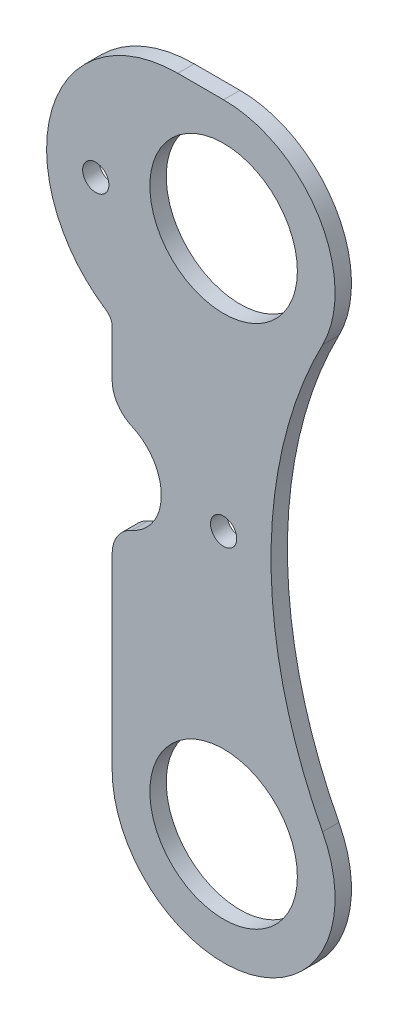
ISO-10303-21;
HEADER;
FILE_DESCRIPTION(('STEP AP214'),'2;1');
FILE_NAME('part.step','',(''),(''),'','','');
FILE_SCHEMA(('AUTOMOTIVE_DESIGN { 1 0 10303 214 1 1 1 1 }'));
ENDSEC;
DATA;
#1=APPLICATION_CONTEXT('core data for automotive mechanical design processes');
#2=APPLICATION_PROTOCOL_DEFINITION('international standard','automotive_design',2000,#1);
#3=PRODUCT_CONTEXT('',#1,'mechanical');
#4=PRODUCT('Part','Part','',(#3));
#5=PRODUCT_RELATED_PRODUCT_CATEGORY('part','',(#4));
#6=PRODUCT_DEFINITION_FORMATION('','',#4);
#7=PRODUCT_DEFINITION_CONTEXT('part definition',#1,'design');
#8=PRODUCT_DEFINITION('design','',#6,#7);
#9=PRODUCT_DEFINITION_SHAPE('','',#8);
#10=(LENGTH_UNIT() NAMED_UNIT(*) SI_UNIT(.MILLI.,.METRE.));
#11=(NAMED_UNIT(*) PLANE_ANGLE_UNIT() SI_UNIT($,.RADIAN.));
#12=(NAMED_UNIT(*) SI_UNIT($,.STERADIAN.) SOLID_ANGLE_UNIT());
#13=UNCERTAINTY_MEASURE_WITH_UNIT(LENGTH_MEASURE(1.E-05),#10,'distance_accuracy_value','');
#14=(GEOMETRIC_REPRESENTATION_CONTEXT(3) GLOBAL_UNCERTAINTY_ASSIGNED_CONTEXT((#13)) GLOBAL_UNIT_ASSIGNED_CONTEXT((#10,
#11,#12)) REPRESENTATION_CONTEXT('',''));
#15=CARTESIAN_POINT('',(0.,0.,0.));
#16=DIRECTION('',(0.,0.,1.));
#17=DIRECTION('',(1.,0.,0.));
#18=AXIS2_PLACEMENT_3D('',#15,#16,#17);
#19=CARTESIAN_POINT('',(0.,0.,3.175));
#20=DIRECTION('',(0.,0.,-1.));
#21=DIRECTION('',(-1.,0.,0.));
#22=AXIS2_PLACEMENT_3D('',#19,#20,#21);
#23=CYLINDRICAL_SURFACE('',#22,21.59);
#24=CARTESIAN_POINT('',(0.,0.,0.));
#25=DIRECTION('',(0.,0.,-1.));
#26=DIRECTION('',(-1.,0.,0.));
#27=AXIS2_PLACEMENT_3D('',#24,#25,#26);
#28=CIRCLE('',#27,21.59);
#29=CARTESIAN_POINT('',(0.,21.59,0.));
#30=VERTEX_POINT('',#29);
#31=CARTESIAN_POINT('',(19.1590830035103,-9.9527703914339,0.));
#32=VERTEX_POINT('',#31);
#33=EDGE_CURVE('E211',#30,#32,#28,.T.);
#34=ORIENTED_EDGE('',*,*,#33,.F.);
#35=DIRECTION('',(0.,0.,1.));
#36=VECTOR('',#35,1.);
#37=CARTESIAN_POINT('',(0.,21.59,0.));
#38=LINE('',#37,#36);
#39=CARTESIAN_POINT('',(0.,21.59,3.175));
#40=VERTEX_POINT('',#39);
#41=EDGE_CURVE('E166',#30,#40,#38,.T.);
#42=ORIENTED_EDGE('',*,*,#41,.T.);
#43=CARTESIAN_POINT('',(0.,0.,3.175));
#44=DIRECTION('',(0.,0.,-1.));
#45=DIRECTION('',(-1.,0.,0.));
#46=AXIS2_PLACEMENT_3D('',#43,#44,#45);
#47=CIRCLE('',#46,21.59);
#48=CARTESIAN_POINT('',(19.1590830035103,-9.9527703914339,3.175));
#49=VERTEX_POINT('',#48);
#50=EDGE_CURVE('E206',#40,#49,#47,.T.);
#51=ORIENTED_EDGE('',*,*,#50,.T.);
#52=DIRECTION('',(0.,0.,-1.));
#53=VECTOR('',#52,1.);
#54=CARTESIAN_POINT('',(19.1590830035103,-9.9527703914339,3.175));
#55=LINE('',#54,#53);
#56=EDGE_CURVE('E214',#49,#32,#55,.T.);
#57=ORIENTED_EDGE('',*,*,#56,.T.);
#58=EDGE_LOOP('',(#34,#42,#51,#57));
#59=FACE_BOUND('',#58,.T.);
#60=ADVANCED_FACE('F74',(#59),#23,.T.);
#61=CARTESIAN_POINT('',(0.,-101.6,3.175));
#62=DIRECTION('',(0.,0.,-1.));
#63=DIRECTION('',(-1.,0.,0.));
#64=AXIS2_PLACEMENT_3D('',#61,#62,#63);
#65=CYLINDRICAL_SURFACE('',#64,14.2875);
#66=CARTESIAN_POINT('',(0.,-101.6,3.175));
#67=DIRECTION('',(0.,0.,1.));
#68=DIRECTION('',(1.,0.,0.));
#69=AXIS2_PLACEMENT_3D('',#66,#67,#68);
#70=CIRCLE('',#69,14.2875);
#71=CARTESIAN_POINT('',(14.2875,-101.6,3.175));
#72=VERTEX_POINT('',#71);
#73=EDGE_CURVE('E226',#72,#72,#70,.T.);
#74=ORIENTED_EDGE('',*,*,#73,.T.);
#75=EDGE_LOOP('',(#74));
#76=FACE_BOUND('',#75,.T.);
#77=CARTESIAN_POINT('',(0.,-101.6,0.));
#78=DIRECTION('',(0.,0.,1.));
#79=DIRECTION('',(1.,0.,0.));
#80=AXIS2_PLACEMENT_3D('',#77,#78,#79);
#81=CIRCLE('',#80,14.2875);
#82=CARTESIAN_POINT('',(14.2875,-101.6,0.));
#83=VERTEX_POINT('',#82);
#84=EDGE_CURVE('E223',#83,#83,#81,.T.);
#85=ORIENTED_EDGE('',*,*,#84,.F.);
#86=EDGE_LOOP('',(#85));
#87=FACE_BOUND('',#86,.T.);
#88=ADVANCED_FACE('F304',(#76,#87),#65,.F.);
#89=CARTESIAN_POINT('',(0.,0.,3.175));
#90=DIRECTION('',(0.,0.,-1.));
#91=DIRECTION('',(-1.,0.,0.));
#92=AXIS2_PLACEMENT_3D('',#89,#90,#91);
#93=CYLINDRICAL_SURFACE('',#92,14.2875);
#94=CARTESIAN_POINT('',(0.,0.,3.175));
#95=DIRECTION('',(0.,0.,1.));
#96=DIRECTION('',(1.,0.,0.));
#97=AXIS2_PLACEMENT_3D('',#94,#95,#96);
#98=CIRCLE('',#97,14.2875);
#99=CARTESIAN_POINT('',(14.2875,0.,3.175));
#100=VERTEX_POINT('',#99);
#101=EDGE_CURVE('E232',#100,#100,#98,.T.);
#102=ORIENTED_EDGE('',*,*,#101,.T.);
#103=EDGE_LOOP('',(#102));
#104=FACE_BOUND('',#103,.T.);
#105=CARTESIAN_POINT('',(0.,0.,0.));
#106=DIRECTION('',(0.,0.,1.));
#107=DIRECTION('',(1.,0.,0.));
#108=AXIS2_PLACEMENT_3D('',#105,#106,#107);
#109=CIRCLE('',#108,14.2875);
#110=CARTESIAN_POINT('',(14.2875,0.,0.));
#111=VERTEX_POINT('',#110);
#112=EDGE_CURVE('E229',#111,#111,#109,.T.);
#113=ORIENTED_EDGE('',*,*,#112,.F.);
#114=EDGE_LOOP('',(#113));
#115=FACE_BOUND('',#114,.T.);
#116=ADVANCED_FACE('F309',(#104,#115),#93,.F.);
#117=CARTESIAN_POINT('',(0.,-50.8,3.175));
#118=DIRECTION('',(0.,0.,-1.));
#119=DIRECTION('',(-1.,0.,0.));
#120=AXIS2_PLACEMENT_3D('',#117,#118,#119);
#121=CYLINDRICAL_SURFACE('',#120,2.54);
#122=CARTESIAN_POINT('',(0.,-50.8,3.175));
#123=DIRECTION('',(0.,0.,1.));
#124=DIRECTION('',(1.,0.,0.));
#125=AXIS2_PLACEMENT_3D('',#122,#123,#124);
#126=CIRCLE('',#125,2.54);
#127=CARTESIAN_POINT('',(2.54000000000001,-50.8,3.175));
#128=VERTEX_POINT('',#127);
#129=EDGE_CURVE('E220',#128,#128,#126,.T.);
#130=ORIENTED_EDGE('',*,*,#129,.T.);
#131=EDGE_LOOP('',(#130));
#132=FACE_BOUND('',#131,.T.);
#133=CARTESIAN_POINT('',(0.,-50.8,0.));
#134=DIRECTION('',(0.,0.,1.));
#135=DIRECTION('',(1.,0.,0.));
#136=AXIS2_PLACEMENT_3D('',#133,#134,#135);
#137=CIRCLE('',#136,2.54);
#138=CARTESIAN_POINT('',(2.54000000000001,-50.8,0.));
#139=VERTEX_POINT('',#138);
#140=EDGE_CURVE('E217',#139,#139,#137,.T.);
#141=ORIENTED_EDGE('',*,*,#140,.F.);
#142=EDGE_LOOP('',(#141));
#143=FACE_BOUND('',#142,.T.);
#144=ADVANCED_FACE('F317',(#132,#143),#121,.F.);
#145=CARTESIAN_POINT('',(-21.59,12.7,3.175));
#146=DIRECTION('',(1.,0.,0.));
#147=DIRECTION('',(0.,1.,0.));
#148=AXIS2_PLACEMENT_3D('',#145,#146,#147);
#149=PLANE('',#148);
#150=DIRECTION('',(0.,-1.,0.));
#151=VECTOR('',#150,1.);
#152=CARTESIAN_POINT('',(-21.59,12.7,3.175));
#153=LINE('',#152,#151);
#154=CARTESIAN_POINT('',(-21.59,-27.2276429215239,3.175));
#155=VERTEX_POINT('',#154);
#156=CARTESIAN_POINT('',(-21.59,-36.2503221685152,3.175));
#157=VERTEX_POINT('',#156);
#158=EDGE_CURVE('E238',#155,#157,#153,.T.);
#159=ORIENTED_EDGE('',*,*,#158,.F.);
#160=DIRECTION('',(0.,0.,1.));
#161=VECTOR('',#160,1.);
#162=CARTESIAN_POINT('',(-21.59,-27.2276429215239,3.175));
#163=LINE('',#162,#161);
#164=CARTESIAN_POINT('',(-21.59,-27.2276429215239,0.));
#165=VERTEX_POINT('',#164);
#166=EDGE_CURVE('E89',#155,#165,#163,.F.);
#167=ORIENTED_EDGE('',*,*,#166,.T.);
#168=DIRECTION('',(0.,-1.,0.));
#169=VECTOR('',#168,1.);
#170=CARTESIAN_POINT('',(-21.59,12.7,0.));
#171=LINE('',#170,#169);
#172=CARTESIAN_POINT('',(-21.59,-36.2503221685152,0.));
#173=VERTEX_POINT('',#172);
#174=EDGE_CURVE('E242',#165,#173,#171,.T.);
#175=ORIENTED_EDGE('',*,*,#174,.T.);
#176=DIRECTION('',(0.,0.,1.));
#177=VECTOR('',#176,1.);
#178=CARTESIAN_POINT('',(-21.59,-36.2503221685152,3.175));
#179=LINE('',#178,#177);
#180=EDGE_CURVE('E253',#173,#157,#179,.T.);
#181=ORIENTED_EDGE('',*,*,#180,.T.);
#182=EDGE_LOOP('',(#159,#167,#175,#181));
#183=FACE_BOUND('',#182,.T.);
#184=ADVANCED_FACE('F319',(#183),#149,.F.);
#185=CARTESIAN_POINT('',(-21.59,-65.3496778314848,0.));
#186=VERTEX_POINT('',#185);
#187=CARTESIAN_POINT('',(-21.59,-101.6,0.));
#188=VERTEX_POINT('',#187);
#189=EDGE_CURVE('E235',#186,#188,#171,.T.);
#190=ORIENTED_EDGE('',*,*,#189,.T.);
#191=DIRECTION('',(0.,0.,1.));
#192=VECTOR('',#191,1.);
#193=CARTESIAN_POINT('',(-21.59,-101.6,0.));
#194=LINE('',#193,#192);
#195=CARTESIAN_POINT('',(-21.59,-101.6,3.175));
#196=VERTEX_POINT('',#195);
#197=EDGE_CURVE('E188',#188,#196,#194,.T.);
#198=ORIENTED_EDGE('',*,*,#197,.T.);
#199=CARTESIAN_POINT('',(-21.59,-65.3496778314848,3.175));
#200=VERTEX_POINT('',#199);
#201=EDGE_CURVE('E241',#200,#196,#153,.T.);
#202=ORIENTED_EDGE('',*,*,#201,.F.);
#203=DIRECTION('',(0.,0.,1.));
#204=VECTOR('',#203,1.);
#205=CARTESIAN_POINT('',(-21.59,-65.3496778314848,0.));
#206=LINE('',#205,#204);
#207=EDGE_CURVE('E260',#200,#186,#206,.F.);
#208=ORIENTED_EDGE('',*,*,#207,.T.);
#209=EDGE_LOOP('',(#190,#198,#202,#208));
#210=FACE_BOUND('',#209,.T.);
#211=ADVANCED_FACE('F282',(#210),#149,.F.);
#212=CARTESIAN_POINT('',(8.89000000000001,12.7,0.));
#213=DIRECTION('',(0.,0.,-1.));
#214=DIRECTION('',(-1.,0.,0.));
#215=AXIS2_PLACEMENT_3D('',#212,#213,#214);
#216=PLANE('',#215);
#217=ORIENTED_EDGE('',*,*,#174,.F.);
#218=CARTESIAN_POINT('',(-24.13,-27.2276429215239,0.));
#219=DIRECTION('',(0.,0.,-1.));
#220=DIRECTION('',(-1.,0.,0.));
#221=AXIS2_PLACEMENT_3D('',#218,#219,#220);
#222=CIRCLE('',#221,2.54);
#223=CARTESIAN_POINT('',(-22.7445454545454,-25.0987662922945,0.));
#224=VERTEX_POINT('',#223);
#225=EDGE_CURVE('E12',#165,#224,#222,.F.);
#226=ORIENTED_EDGE('',*,*,#225,.T.);
#227=CARTESIAN_POINT('',(-8.89,-3.81,0.));
#228=DIRECTION('',(0.,0.,1.));
#229=DIRECTION('',(1.,0.,0.));
#230=AXIS2_PLACEMENT_3D('',#227,#228,#229);
#231=CIRCLE('',#230,25.4);
#232=CARTESIAN_POINT('',(-8.89,21.59,0.));
#233=VERTEX_POINT('',#232);
#234=EDGE_CURVE('E160',#233,#224,#231,.T.);
#235=ORIENTED_EDGE('',*,*,#234,.F.);
#236=DIRECTION('',(1.,0.,0.));
#237=VECTOR('',#236,1.);
#238=CARTESIAN_POINT('',(0.,21.59,0.));
#239=LINE('',#238,#237);
#240=EDGE_CURVE('E170',#233,#30,#239,.T.);
#241=ORIENTED_EDGE('',*,*,#240,.T.);
#242=ORIENTED_EDGE('',*,*,#33,.T.);
#243=CARTESIAN_POINT('',(97.79,-50.8,0.));
#244=DIRECTION('',(0.,0.,-1.));
#245=DIRECTION('',(-1.,0.,0.));
#246=AXIS2_PLACEMENT_3D('',#243,#244,#245);
#247=CIRCLE('',#246,88.6076592310381);
#248=CARTESIAN_POINT('',(19.1590830035103,-91.6472296085661,0.));
#249=VERTEX_POINT('',#248);
#250=EDGE_CURVE('E196',#249,#32,#247,.T.);
#251=ORIENTED_EDGE('',*,*,#250,.F.);
#252=CARTESIAN_POINT('',(0.,-101.6,0.));
#253=DIRECTION('',(0.,0.,-1.));
#254=DIRECTION('',(-1.,0.,0.));
#255=AXIS2_PLACEMENT_3D('',#252,#253,#254);
#256=CIRCLE('',#255,21.59);
#257=EDGE_CURVE('E203',#249,#188,#256,.T.);
#258=ORIENTED_EDGE('',*,*,#257,.T.);
#259=ORIENTED_EDGE('',*,*,#189,.F.);
#260=CARTESIAN_POINT('',(-15.24,-65.3496778314848,0.));
#261=DIRECTION('',(0.,0.,-1.));
#262=DIRECTION('',(-1.,0.,0.));
#263=AXIS2_PLACEMENT_3D('',#260,#261,#262);
#264=CIRCLE('',#263,6.35);
#265=CARTESIAN_POINT('',(-17.78,-59.5298066988909,0.));
#266=VERTEX_POINT('',#265);
#267=EDGE_CURVE('E248',#186,#266,#264,.T.);
#268=ORIENTED_EDGE('',*,*,#267,.T.);
#269=CARTESIAN_POINT('',(-21.59,-50.8,0.));
#270=DIRECTION('',(0.,0.,1.));
#271=DIRECTION('',(1.,0.,0.));
#272=AXIS2_PLACEMENT_3D('',#269,#270,#271);
#273=CIRCLE('',#272,9.525);
#274=CARTESIAN_POINT('',(-17.78,-42.0701933011091,0.));
#275=VERTEX_POINT('',#274);
#276=EDGE_CURVE('E193',#266,#275,#273,.T.);
#277=ORIENTED_EDGE('',*,*,#276,.T.);
#278=CARTESIAN_POINT('',(-15.24,-36.2503221685152,0.));
#279=DIRECTION('',(0.,0.,-1.));
#280=DIRECTION('',(-1.,0.,0.));
#281=AXIS2_PLACEMENT_3D('',#278,#279,#280);
#282=CIRCLE('',#281,6.35);
#283=EDGE_CURVE('E250',#275,#173,#282,.T.);
#284=ORIENTED_EDGE('',*,*,#283,.T.);
#285=EDGE_LOOP('',(#217,#226,#235,#241,#242,#251,#258,#259,#268,#277,#284));
#286=FACE_BOUND('',#285,.T.);
#287=ORIENTED_EDGE('',*,*,#140,.T.);
#288=EDGE_LOOP('',(#287));
#289=FACE_BOUND('',#288,.T.);
#290=ORIENTED_EDGE('',*,*,#112,.T.);
#291=EDGE_LOOP('',(#290));
#292=FACE_BOUND('',#291,.T.);
#293=ORIENTED_EDGE('',*,*,#84,.T.);
#294=EDGE_LOOP('',(#293));
#295=FACE_BOUND('',#294,.T.);
#296=CARTESIAN_POINT('',(-24.765,-3.81,0.));
#297=DIRECTION('',(0.,0.,1.));
#298=DIRECTION('',(1.,0.,0.));
#299=AXIS2_PLACEMENT_3D('',#296,#297,#298);
#300=CIRCLE('',#299,2.54);
#301=CARTESIAN_POINT('',(-22.225,-3.81,0.));
#302=VERTEX_POINT('',#301);
#303=EDGE_CURVE('E174',#302,#302,#300,.T.);
#304=ORIENTED_EDGE('',*,*,#303,.T.);
#305=EDGE_LOOP('',(#304));
#306=FACE_BOUND('',#305,.T.);
#307=ADVANCED_FACE('F176',(#286,#289,#292,#295,#306),#216,.T.);
#308=CARTESIAN_POINT('',(8.89000000000001,12.7,3.175));
#309=DIRECTION('',(0.,0.,-1.));
#310=DIRECTION('',(-1.,0.,0.));
#311=AXIS2_PLACEMENT_3D('',#308,#309,#310);
#312=PLANE('',#311);
#313=CARTESIAN_POINT('',(-8.89,-3.81,3.175));
#314=DIRECTION('',(0.,0.,1.));
#315=DIRECTION('',(1.,0.,0.));
#316=AXIS2_PLACEMENT_3D('',#313,#314,#315);
#317=CIRCLE('',#316,25.4);
#318=CARTESIAN_POINT('',(-8.89,21.59,3.175));
#319=VERTEX_POINT('',#318);
#320=CARTESIAN_POINT('',(-22.7445454545454,-25.0987662922945,3.175));
#321=VERTEX_POINT('',#320);
#322=EDGE_CURVE('E162',#319,#321,#317,.T.);
#323=ORIENTED_EDGE('',*,*,#322,.T.);
#324=CARTESIAN_POINT('',(-24.13,-27.2276429215239,3.175));
#325=DIRECTION('',(0.,0.,-1.));
#326=DIRECTION('',(-1.,0.,0.));
#327=AXIS2_PLACEMENT_3D('',#324,#325,#326);
#328=CIRCLE('',#327,2.54);
#329=EDGE_CURVE('E82',#321,#155,#328,.T.);
#330=ORIENTED_EDGE('',*,*,#329,.T.);
#331=ORIENTED_EDGE('',*,*,#158,.T.);
#332=CARTESIAN_POINT('',(-15.24,-36.2503221685152,3.175));
#333=DIRECTION('',(0.,0.,-1.));
#334=DIRECTION('',(-1.,0.,0.));
#335=AXIS2_PLACEMENT_3D('',#332,#333,#334);
#336=CIRCLE('',#335,6.35);
#337=CARTESIAN_POINT('',(-17.78,-42.0701933011091,3.175));
#338=VERTEX_POINT('',#337);
#339=EDGE_CURVE('E258',#157,#338,#336,.F.);
#340=ORIENTED_EDGE('',*,*,#339,.T.);
#341=CARTESIAN_POINT('',(-21.59,-50.8,3.175));
#342=DIRECTION('',(0.,0.,1.));
#343=DIRECTION('',(1.,0.,0.));
#344=AXIS2_PLACEMENT_3D('',#341,#342,#343);
#345=CIRCLE('',#344,9.525);
#346=CARTESIAN_POINT('',(-17.78,-59.5298066988909,3.175));
#347=VERTEX_POINT('',#346);
#348=EDGE_CURVE('E192',#347,#338,#345,.T.);
#349=ORIENTED_EDGE('',*,*,#348,.F.);
#350=CARTESIAN_POINT('',(-15.24,-65.3496778314848,3.175));
#351=DIRECTION('',(0.,0.,-1.));
#352=DIRECTION('',(-1.,0.,0.));
#353=AXIS2_PLACEMENT_3D('',#350,#351,#352);
#354=CIRCLE('',#353,6.35);
#355=EDGE_CURVE('E256',#347,#200,#354,.F.);
#356=ORIENTED_EDGE('',*,*,#355,.T.);
#357=ORIENTED_EDGE('',*,*,#201,.T.);
#358=CARTESIAN_POINT('',(0.,-101.6,3.175));
#359=DIRECTION('',(0.,0.,1.));
#360=DIRECTION('',(1.,0.,0.));
#361=AXIS2_PLACEMENT_3D('',#358,#359,#360);
#362=CIRCLE('',#361,21.59);
#363=CARTESIAN_POINT('',(19.1590830035103,-91.6472296085661,3.175));
#364=VERTEX_POINT('',#363);
#365=EDGE_CURVE('E199',#196,#364,#362,.T.);
#366=ORIENTED_EDGE('',*,*,#365,.T.);
#367=CARTESIAN_POINT('',(97.79,-50.8,3.175));
#368=DIRECTION('',(0.,0.,-1.));
#369=DIRECTION('',(-1.,0.,0.));
#370=AXIS2_PLACEMENT_3D('',#367,#368,#369);
#371=CIRCLE('',#370,88.6076592310381);
#372=EDGE_CURVE('E202',#364,#49,#371,.T.);
#373=ORIENTED_EDGE('',*,*,#372,.T.);
#374=ORIENTED_EDGE('',*,*,#50,.F.);
#375=DIRECTION('',(1.,0.,0.));
#376=VECTOR('',#375,1.);
#377=CARTESIAN_POINT('',(0.,21.59,3.175));
#378=LINE('',#377,#376);
#379=EDGE_CURVE('E185',#319,#40,#378,.T.);
#380=ORIENTED_EDGE('',*,*,#379,.F.);
#381=EDGE_LOOP('',(#323,#330,#331,#340,#349,#356,#357,#366,#373,#374,#380));
#382=FACE_BOUND('',#381,.T.);
#383=ORIENTED_EDGE('',*,*,#101,.F.);
#384=EDGE_LOOP('',(#383));
#385=FACE_BOUND('',#384,.T.);
#386=ORIENTED_EDGE('',*,*,#73,.F.);
#387=EDGE_LOOP('',(#386));
#388=FACE_BOUND('',#387,.T.);
#389=ORIENTED_EDGE('',*,*,#129,.F.);
#390=EDGE_LOOP('',(#389));
#391=FACE_BOUND('',#390,.T.);
#392=CARTESIAN_POINT('',(-24.765,-3.81,3.175));
#393=DIRECTION('',(0.,0.,1.));
#394=DIRECTION('',(1.,0.,0.));
#395=AXIS2_PLACEMENT_3D('',#392,#393,#394);
#396=CIRCLE('',#395,2.54);
#397=CARTESIAN_POINT('',(-22.225,-3.81,3.175));
#398=VERTEX_POINT('',#397);
#399=EDGE_CURVE('E182',#398,#398,#396,.T.);
#400=ORIENTED_EDGE('',*,*,#399,.F.);
#401=EDGE_LOOP('',(#400));
#402=FACE_BOUND('',#401,.T.);
#403=ADVANCED_FACE('F266',(#382,#385,#388,#391,#402),#312,.F.);
#404=CARTESIAN_POINT('',(97.79,-50.8,3.175));
#405=DIRECTION('',(0.,0.,-1.));
#406=DIRECTION('',(-1.,0.,0.));
#407=AXIS2_PLACEMENT_3D('',#404,#405,#406);
#408=CYLINDRICAL_SURFACE('',#407,88.6076592310381);
#409=ORIENTED_EDGE('',*,*,#250,.T.);
#410=ORIENTED_EDGE('',*,*,#56,.F.);
#411=ORIENTED_EDGE('',*,*,#372,.F.);
#412=DIRECTION('',(0.,0.,-1.));
#413=VECTOR('',#412,1.);
#414=CARTESIAN_POINT('',(19.1590830035103,-91.6472296085661,3.175));
#415=LINE('',#414,#413);
#416=EDGE_CURVE('E208',#364,#249,#415,.T.);
#417=ORIENTED_EDGE('',*,*,#416,.T.);
#418=EDGE_LOOP('',(#409,#410,#411,#417));
#419=FACE_BOUND('',#418,.T.);
#420=ADVANCED_FACE('F275',(#419),#408,.F.);
#421=CARTESIAN_POINT('',(0.,-101.6,3.175));
#422=DIRECTION('',(0.,0.,-1.));
#423=DIRECTION('',(-1.,0.,0.));
#424=AXIS2_PLACEMENT_3D('',#421,#422,#423);
#425=CYLINDRICAL_SURFACE('',#424,21.59);
#426=ORIENTED_EDGE('',*,*,#365,.F.);
#427=ORIENTED_EDGE('',*,*,#197,.F.);
#428=ORIENTED_EDGE('',*,*,#257,.F.);
#429=ORIENTED_EDGE('',*,*,#416,.F.);
#430=EDGE_LOOP('',(#426,#427,#428,#429));
#431=FACE_BOUND('',#430,.T.);
#432=ADVANCED_FACE('F277',(#431),#425,.T.);
#433=CARTESIAN_POINT('',(-21.59,-50.8,3.175));
#434=DIRECTION('',(0.,0.,-1.));
#435=DIRECTION('',(-1.,0.,0.));
#436=AXIS2_PLACEMENT_3D('',#433,#434,#435);
#437=CYLINDRICAL_SURFACE('',#436,9.525);
#438=ORIENTED_EDGE('',*,*,#348,.T.);
#439=DIRECTION('',(0.,0.,-1.));
#440=VECTOR('',#439,1.);
#441=CARTESIAN_POINT('',(-17.78,-42.0701933011091,3.175));
#442=LINE('',#441,#440);
#443=EDGE_CURVE('E245',#338,#275,#442,.T.);
#444=ORIENTED_EDGE('',*,*,#443,.T.);
#445=ORIENTED_EDGE('',*,*,#276,.F.);
#446=DIRECTION('',(0.,0.,-1.));
#447=VECTOR('',#446,1.);
#448=CARTESIAN_POINT('',(-17.78,-59.5298066988909,3.175));
#449=LINE('',#448,#447);
#450=EDGE_CURVE('E240',#266,#347,#449,.F.);
#451=ORIENTED_EDGE('',*,*,#450,.T.);
#452=EDGE_LOOP('',(#438,#444,#445,#451));
#453=FACE_BOUND('',#452,.T.);
#454=ADVANCED_FACE('F288',(#453),#437,.F.);
#455=CARTESIAN_POINT('',(-15.24,-36.2503221685152,3.175));
#456=DIRECTION('',(0.,0.,-1.));
#457=DIRECTION('',(-1.,0.,0.));
#458=AXIS2_PLACEMENT_3D('',#455,#456,#457);
#459=CYLINDRICAL_SURFACE('',#458,6.35);
#460=ORIENTED_EDGE('',*,*,#339,.F.);
#461=ORIENTED_EDGE('',*,*,#180,.F.);
#462=ORIENTED_EDGE('',*,*,#283,.F.);
#463=ORIENTED_EDGE('',*,*,#443,.F.);
#464=EDGE_LOOP('',(#460,#461,#462,#463));
#465=FACE_BOUND('',#464,.T.);
#466=ADVANCED_FACE('F295',(#465),#459,.T.);
#467=CARTESIAN_POINT('',(-15.24,-65.3496778314848,3.175));
#468=DIRECTION('',(0.,0.,-1.));
#469=DIRECTION('',(-1.,0.,0.));
#470=AXIS2_PLACEMENT_3D('',#467,#468,#469);
#471=CYLINDRICAL_SURFACE('',#470,6.35);
#472=ORIENTED_EDGE('',*,*,#355,.F.);
#473=ORIENTED_EDGE('',*,*,#450,.F.);
#474=ORIENTED_EDGE('',*,*,#267,.F.);
#475=ORIENTED_EDGE('',*,*,#207,.F.);
#476=EDGE_LOOP('',(#472,#473,#474,#475));
#477=FACE_BOUND('',#476,.T.);
#478=ADVANCED_FACE('F292',(#477),#471,.T.);
#479=CARTESIAN_POINT('',(0.,21.59,0.));
#480=DIRECTION('',(0.,-1.,0.));
#481=DIRECTION('',(0.,0.,-1.));
#482=AXIS2_PLACEMENT_3D('',#479,#480,#481);
#483=PLANE('',#482);
#484=ORIENTED_EDGE('',*,*,#379,.T.);
#485=ORIENTED_EDGE('',*,*,#41,.F.);
#486=ORIENTED_EDGE('',*,*,#240,.F.);
#487=DIRECTION('',(0.,0.,1.));
#488=VECTOR('',#487,1.);
#489=CARTESIAN_POINT('',(-8.89,21.59,0.));
#490=LINE('',#489,#488);
#491=EDGE_CURVE('E155',#233,#319,#490,.T.);
#492=ORIENTED_EDGE('',*,*,#491,.T.);
#493=EDGE_LOOP('',(#484,#485,#486,#492));
#494=FACE_BOUND('',#493,.T.);
#495=ADVANCED_FACE('F171',(#494),#483,.F.);
#496=CARTESIAN_POINT('',(-24.765,-3.81,0.));
#497=DIRECTION('',(0.,0.,1.));
#498=DIRECTION('',(1.,0.,0.));
#499=AXIS2_PLACEMENT_3D('',#496,#497,#498);
#500=CYLINDRICAL_SURFACE('',#499,2.54);
#501=ORIENTED_EDGE('',*,*,#303,.F.);
#502=EDGE_LOOP('',(#501));
#503=FACE_BOUND('',#502,.T.);
#504=ORIENTED_EDGE('',*,*,#399,.T.);
#505=EDGE_LOOP('',(#504));
#506=FACE_BOUND('',#505,.T.);
#507=ADVANCED_FACE('F301',(#503,#506),#500,.F.);
#508=CARTESIAN_POINT('',(-8.89,-3.81,0.));
#509=DIRECTION('',(0.,0.,1.));
#510=DIRECTION('',(1.,0.,0.));
#511=AXIS2_PLACEMENT_3D('',#508,#509,#510);
#512=CYLINDRICAL_SURFACE('',#511,25.4);
#513=ORIENTED_EDGE('',*,*,#234,.T.);
#514=DIRECTION('',(0.,0.,1.));
#515=VECTOR('',#514,1.);
#516=CARTESIAN_POINT('',(-22.7445454545455,-25.0987662922945,0.));
#517=LINE('',#516,#515);
#518=EDGE_CURVE('E263',#224,#321,#517,.T.);
#519=ORIENTED_EDGE('',*,*,#518,.T.);
#520=ORIENTED_EDGE('',*,*,#322,.F.);
#521=ORIENTED_EDGE('',*,*,#491,.F.);
#522=EDGE_LOOP('',(#513,#519,#520,#521));
#523=FACE_BOUND('',#522,.T.);
#524=ADVANCED_FACE('F157',(#523),#512,.T.);
#525=CARTESIAN_POINT('',(-24.13,-27.2276429215239,0.));
#526=DIRECTION('',(0.,0.,1.));
#527=DIRECTION('',(1.,0.,0.));
#528=AXIS2_PLACEMENT_3D('',#525,#526,#527);
#529=CYLINDRICAL_SURFACE('',#528,2.54);
#530=ORIENTED_EDGE('',*,*,#225,.F.);
#531=ORIENTED_EDGE('',*,*,#166,.F.);
#532=ORIENTED_EDGE('',*,*,#329,.F.);
#533=ORIENTED_EDGE('',*,*,#518,.F.);
#534=EDGE_LOOP('',(#530,#531,#532,#533));
#535=FACE_BOUND('',#534,.T.);
#536=ADVANCED_FACE('F76',(#535),#529,.F.);
#537=CLOSED_SHELL('',(#60,#88,#116,#144,#184,#211,#307,#403,#420,#432,#454,#466,#478,#495,#507,
#524,#536));
#538=MANIFOLD_SOLID_BREP('B2',#537);
#539=ADVANCED_BREP_SHAPE_REPRESENTATION('',(#18,#538),#14);
#540=SHAPE_DEFINITION_REPRESENTATION(#9,#539);
ENDSEC;
END-ISO-10303-21;
